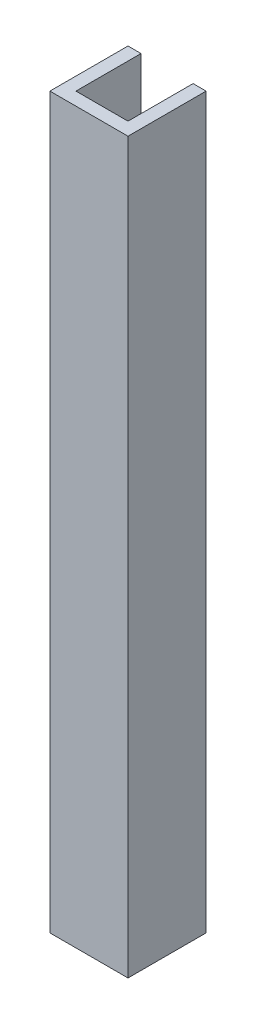
ISO-10303-21;
HEADER;
FILE_DESCRIPTION(('STEP AP214'),'2;1');
FILE_NAME('part.step','',(''),(''),'','','');
FILE_SCHEMA(('AUTOMOTIVE_DESIGN { 1 0 10303 214 1 1 1 1 }'));
ENDSEC;
DATA;
#1=APPLICATION_CONTEXT('core data for automotive mechanical design processes');
#2=APPLICATION_PROTOCOL_DEFINITION('international standard','automotive_design',2000,#1);
#3=PRODUCT_CONTEXT('',#1,'mechanical');
#4=PRODUCT('Part','Part','',(#3));
#5=PRODUCT_RELATED_PRODUCT_CATEGORY('part','',(#4));
#6=PRODUCT_DEFINITION_FORMATION('','',#4);
#7=PRODUCT_DEFINITION_CONTEXT('part definition',#1,'design');
#8=PRODUCT_DEFINITION('design','',#6,#7);
#9=PRODUCT_DEFINITION_SHAPE('','',#8);
#10=(LENGTH_UNIT() NAMED_UNIT(*) SI_UNIT(.MILLI.,.METRE.));
#11=(NAMED_UNIT(*) PLANE_ANGLE_UNIT() SI_UNIT($,.RADIAN.));
#12=(NAMED_UNIT(*) SI_UNIT($,.STERADIAN.) SOLID_ANGLE_UNIT());
#13=UNCERTAINTY_MEASURE_WITH_UNIT(LENGTH_MEASURE(1.E-05),#10,'distance_accuracy_value','');
#14=(GEOMETRIC_REPRESENTATION_CONTEXT(3) GLOBAL_UNCERTAINTY_ASSIGNED_CONTEXT((#13)) GLOBAL_UNIT_ASSIGNED_CONTEXT((#10,
#11,#12)) REPRESENTATION_CONTEXT('',''));
#15=CARTESIAN_POINT('',(0.,0.,0.));
#16=DIRECTION('',(0.,0.,1.));
#17=DIRECTION('',(1.,0.,0.));
#18=AXIS2_PLACEMENT_3D('',#15,#16,#17);
#19=CARTESIAN_POINT('',(0.,177.8,0.));
#20=DIRECTION('',(1.,0.,0.));
#21=DIRECTION('',(0.,0.,-1.));
#22=AXIS2_PLACEMENT_3D('',#19,#20,#21);
#23=PLANE('',#22);
#24=DIRECTION('',(0.,0.,1.));
#25=VECTOR('',#24,1.);
#26=CARTESIAN_POINT('',(0.,0.,0.));
#27=LINE('',#26,#25);
#28=CARTESIAN_POINT('',(0.,0.,-19.05));
#29=VERTEX_POINT('',#28);
#30=CARTESIAN_POINT('',(0.,0.,0.));
#31=VERTEX_POINT('',#30);
#32=EDGE_CURVE('E129',#29,#31,#27,.T.);
#33=ORIENTED_EDGE('',*,*,#32,.T.);
#34=DIRECTION('',(0.,-1.,0.));
#35=VECTOR('',#34,1.);
#36=CARTESIAN_POINT('',(0.,177.8,0.));
#37=LINE('',#36,#35);
#38=CARTESIAN_POINT('',(0.,177.8,0.));
#39=VERTEX_POINT('',#38);
#40=EDGE_CURVE('E11',#39,#31,#37,.T.);
#41=ORIENTED_EDGE('',*,*,#40,.F.);
#42=DIRECTION('',(0.,0.,1.));
#43=VECTOR('',#42,1.);
#44=CARTESIAN_POINT('',(0.,177.8,0.));
#45=LINE('',#44,#43);
#46=CARTESIAN_POINT('',(0.,177.8,-19.05));
#47=VERTEX_POINT('',#46);
#48=EDGE_CURVE('E143',#47,#39,#45,.T.);
#49=ORIENTED_EDGE('',*,*,#48,.F.);
#50=DIRECTION('',(0.,-1.,0.));
#51=VECTOR('',#50,1.);
#52=CARTESIAN_POINT('',(0.,177.8,-19.05));
#53=LINE('',#52,#51);
#54=EDGE_CURVE('E125',#47,#29,#53,.T.);
#55=ORIENTED_EDGE('',*,*,#54,.T.);
#56=EDGE_LOOP('',(#33,#41,#49,#55));
#57=FACE_BOUND('',#56,.T.);
#58=ADVANCED_FACE('F33',(#57),#23,.F.);
#59=CARTESIAN_POINT('',(0.,177.8,0.));
#60=DIRECTION('',(0.,0.,-1.));
#61=DIRECTION('',(-1.,0.,0.));
#62=AXIS2_PLACEMENT_3D('',#59,#60,#61);
#63=PLANE('',#62);
#64=DIRECTION('',(1.,0.,0.));
#65=VECTOR('',#64,1.);
#66=CARTESIAN_POINT('',(0.,0.,0.));
#67=LINE('',#66,#65);
#68=CARTESIAN_POINT('',(19.05,0.,0.));
#69=VERTEX_POINT('',#68);
#70=EDGE_CURVE('E132',#31,#69,#67,.T.);
#71=ORIENTED_EDGE('',*,*,#70,.T.);
#72=DIRECTION('',(0.,-1.,0.));
#73=VECTOR('',#72,1.);
#74=CARTESIAN_POINT('',(19.05,177.8,0.));
#75=LINE('',#74,#73);
#76=CARTESIAN_POINT('',(19.05,177.8,0.));
#77=VERTEX_POINT('',#76);
#78=EDGE_CURVE('E41',#77,#69,#75,.T.);
#79=ORIENTED_EDGE('',*,*,#78,.F.);
#80=DIRECTION('',(1.,0.,0.));
#81=VECTOR('',#80,1.);
#82=CARTESIAN_POINT('',(0.,177.8,0.));
#83=LINE('',#82,#81);
#84=EDGE_CURVE('E92',#39,#77,#83,.T.);
#85=ORIENTED_EDGE('',*,*,#84,.F.);
#86=ORIENTED_EDGE('',*,*,#40,.T.);
#87=EDGE_LOOP('',(#71,#79,#85,#86));
#88=FACE_BOUND('',#87,.T.);
#89=ADVANCED_FACE('F178',(#88),#63,.F.);
#90=CARTESIAN_POINT('',(19.05,177.8,-19.05));
#91=DIRECTION('',(-1.,0.,0.));
#92=DIRECTION('',(0.,0.,1.));
#93=AXIS2_PLACEMENT_3D('',#90,#91,#92);
#94=PLANE('',#93);
#95=DIRECTION('',(0.,0.,-1.));
#96=VECTOR('',#95,1.);
#97=CARTESIAN_POINT('',(19.05,0.,-19.05));
#98=LINE('',#97,#96);
#99=CARTESIAN_POINT('',(19.05,0.,-19.05));
#100=VERTEX_POINT('',#99);
#101=EDGE_CURVE('E134',#69,#100,#98,.T.);
#102=ORIENTED_EDGE('',*,*,#101,.T.);
#103=DIRECTION('',(0.,-1.,0.));
#104=VECTOR('',#103,1.);
#105=CARTESIAN_POINT('',(19.05,177.8,-19.05));
#106=LINE('',#105,#104);
#107=CARTESIAN_POINT('',(19.05,177.8,-19.05));
#108=VERTEX_POINT('',#107);
#109=EDGE_CURVE('E150',#108,#100,#106,.T.);
#110=ORIENTED_EDGE('',*,*,#109,.F.);
#111=DIRECTION('',(0.,0.,-1.));
#112=VECTOR('',#111,1.);
#113=CARTESIAN_POINT('',(19.05,177.8,-19.05));
#114=LINE('',#113,#112);
#115=EDGE_CURVE('E158',#77,#108,#114,.T.);
#116=ORIENTED_EDGE('',*,*,#115,.F.);
#117=ORIENTED_EDGE('',*,*,#78,.T.);
#118=EDGE_LOOP('',(#102,#110,#116,#117));
#119=FACE_BOUND('',#118,.T.);
#120=ADVANCED_FACE('F156',(#119),#94,.F.);
#121=CARTESIAN_POINT('',(15.875,177.8,-19.05));
#122=DIRECTION('',(0.,0.,1.));
#123=DIRECTION('',(1.,0.,0.));
#124=AXIS2_PLACEMENT_3D('',#121,#122,#123);
#125=PLANE('',#124);
#126=DIRECTION('',(-1.,0.,0.));
#127=VECTOR('',#126,1.);
#128=CARTESIAN_POINT('',(15.875,0.,-19.05));
#129=LINE('',#128,#127);
#130=CARTESIAN_POINT('',(15.875,0.,-19.05));
#131=VERTEX_POINT('',#130);
#132=EDGE_CURVE('E136',#100,#131,#129,.T.);
#133=ORIENTED_EDGE('',*,*,#132,.T.);
#134=DIRECTION('',(0.,-1.,0.));
#135=VECTOR('',#134,1.);
#136=CARTESIAN_POINT('',(15.875,177.8,-19.05));
#137=LINE('',#136,#135);
#138=CARTESIAN_POINT('',(15.875,177.8,-19.05));
#139=VERTEX_POINT('',#138);
#140=EDGE_CURVE('E147',#139,#131,#137,.T.);
#141=ORIENTED_EDGE('',*,*,#140,.F.);
#142=DIRECTION('',(-1.,0.,0.));
#143=VECTOR('',#142,1.);
#144=CARTESIAN_POINT('',(15.875,177.8,-19.05));
#145=LINE('',#144,#143);
#146=EDGE_CURVE('E170',#108,#139,#145,.T.);
#147=ORIENTED_EDGE('',*,*,#146,.F.);
#148=ORIENTED_EDGE('',*,*,#109,.T.);
#149=EDGE_LOOP('',(#133,#141,#147,#148));
#150=FACE_BOUND('',#149,.T.);
#151=ADVANCED_FACE('F166',(#150),#125,.F.);
#152=CARTESIAN_POINT('',(15.875,177.8,-3.175));
#153=DIRECTION('',(1.,0.,0.));
#154=DIRECTION('',(0.,0.,-1.));
#155=AXIS2_PLACEMENT_3D('',#152,#153,#154);
#156=PLANE('',#155);
#157=DIRECTION('',(0.,0.,1.));
#158=VECTOR('',#157,1.);
#159=CARTESIAN_POINT('',(15.875,0.,-3.175));
#160=LINE('',#159,#158);
#161=CARTESIAN_POINT('',(15.875,0.,-3.175));
#162=VERTEX_POINT('',#161);
#163=EDGE_CURVE('E138',#131,#162,#160,.T.);
#164=ORIENTED_EDGE('',*,*,#163,.T.);
#165=DIRECTION('',(0.,-1.,0.));
#166=VECTOR('',#165,1.);
#167=CARTESIAN_POINT('',(15.875,177.8,-3.175));
#168=LINE('',#167,#166);
#169=CARTESIAN_POINT('',(15.875,177.8,-3.175));
#170=VERTEX_POINT('',#169);
#171=EDGE_CURVE('E120',#170,#162,#168,.T.);
#172=ORIENTED_EDGE('',*,*,#171,.F.);
#173=DIRECTION('',(0.,0.,1.));
#174=VECTOR('',#173,1.);
#175=CARTESIAN_POINT('',(15.875,177.8,-3.175));
#176=LINE('',#175,#174);
#177=EDGE_CURVE('E111',#139,#170,#176,.T.);
#178=ORIENTED_EDGE('',*,*,#177,.F.);
#179=ORIENTED_EDGE('',*,*,#140,.T.);
#180=EDGE_LOOP('',(#164,#172,#178,#179));
#181=FACE_BOUND('',#180,.T.);
#182=ADVANCED_FACE('F169',(#181),#156,.F.);
#183=CARTESIAN_POINT('',(3.175,177.8,-3.175));
#184=DIRECTION('',(0.,0.,1.));
#185=DIRECTION('',(1.,0.,0.));
#186=AXIS2_PLACEMENT_3D('',#183,#184,#185);
#187=PLANE('',#186);
#188=DIRECTION('',(-1.,0.,0.));
#189=VECTOR('',#188,1.);
#190=CARTESIAN_POINT('',(3.175,0.,-3.175));
#191=LINE('',#190,#189);
#192=CARTESIAN_POINT('',(3.175,0.,-3.175));
#193=VERTEX_POINT('',#192);
#194=EDGE_CURVE('E119',#162,#193,#191,.T.);
#195=ORIENTED_EDGE('',*,*,#194,.T.);
#196=DIRECTION('',(0.,-1.,0.));
#197=VECTOR('',#196,1.);
#198=CARTESIAN_POINT('',(3.175,177.8,-3.175));
#199=LINE('',#198,#197);
#200=CARTESIAN_POINT('',(3.175,177.8,-3.175));
#201=VERTEX_POINT('',#200);
#202=EDGE_CURVE('E116',#201,#193,#199,.T.);
#203=ORIENTED_EDGE('',*,*,#202,.F.);
#204=DIRECTION('',(-1.,0.,0.));
#205=VECTOR('',#204,1.);
#206=CARTESIAN_POINT('',(3.175,177.8,-3.175));
#207=LINE('',#206,#205);
#208=EDGE_CURVE('E105',#170,#201,#207,.T.);
#209=ORIENTED_EDGE('',*,*,#208,.F.);
#210=ORIENTED_EDGE('',*,*,#171,.T.);
#211=EDGE_LOOP('',(#195,#203,#209,#210));
#212=FACE_BOUND('',#211,.T.);
#213=ADVANCED_FACE('F117',(#212),#187,.F.);
#214=CARTESIAN_POINT('',(3.175,177.8,-19.05));
#215=DIRECTION('',(-1.,0.,0.));
#216=DIRECTION('',(0.,0.,1.));
#217=AXIS2_PLACEMENT_3D('',#214,#215,#216);
#218=PLANE('',#217);
#219=DIRECTION('',(0.,0.,-1.));
#220=VECTOR('',#219,1.);
#221=CARTESIAN_POINT('',(3.175,0.,-19.05));
#222=LINE('',#221,#220);
#223=CARTESIAN_POINT('',(3.175,0.,-19.05));
#224=VERTEX_POINT('',#223);
#225=EDGE_CURVE('E78',#193,#224,#222,.T.);
#226=ORIENTED_EDGE('',*,*,#225,.T.);
#227=DIRECTION('',(0.,-1.,0.));
#228=VECTOR('',#227,1.);
#229=CARTESIAN_POINT('',(3.175,177.8,-19.05));
#230=LINE('',#229,#228);
#231=CARTESIAN_POINT('',(3.175,177.8,-19.05));
#232=VERTEX_POINT('',#231);
#233=EDGE_CURVE('E121',#232,#224,#230,.T.);
#234=ORIENTED_EDGE('',*,*,#233,.F.);
#235=DIRECTION('',(0.,0.,-1.));
#236=VECTOR('',#235,1.);
#237=CARTESIAN_POINT('',(3.175,177.8,-19.05));
#238=LINE('',#237,#236);
#239=EDGE_CURVE('E109',#201,#232,#238,.T.);
#240=ORIENTED_EDGE('',*,*,#239,.F.);
#241=ORIENTED_EDGE('',*,*,#202,.T.);
#242=EDGE_LOOP('',(#226,#234,#240,#241));
#243=FACE_BOUND('',#242,.T.);
#244=ADVANCED_FACE('F123',(#243),#218,.F.);
#245=CARTESIAN_POINT('',(0.,177.8,-19.05));
#246=DIRECTION('',(0.,0.,1.));
#247=DIRECTION('',(1.,0.,0.));
#248=AXIS2_PLACEMENT_3D('',#245,#246,#247);
#249=PLANE('',#248);
#250=DIRECTION('',(-1.,0.,0.));
#251=VECTOR('',#250,1.);
#252=CARTESIAN_POINT('',(0.,0.,-19.05));
#253=LINE('',#252,#251);
#254=EDGE_CURVE('E84',#224,#29,#253,.T.);
#255=ORIENTED_EDGE('',*,*,#254,.T.);
#256=ORIENTED_EDGE('',*,*,#54,.F.);
#257=DIRECTION('',(-1.,0.,0.));
#258=VECTOR('',#257,1.);
#259=CARTESIAN_POINT('',(0.,177.8,-19.05));
#260=LINE('',#259,#258);
#261=EDGE_CURVE('E49',#232,#47,#260,.T.);
#262=ORIENTED_EDGE('',*,*,#261,.F.);
#263=ORIENTED_EDGE('',*,*,#233,.T.);
#264=EDGE_LOOP('',(#255,#256,#262,#263));
#265=FACE_BOUND('',#264,.T.);
#266=ADVANCED_FACE('F194',(#265),#249,.F.);
#267=CARTESIAN_POINT('',(0.,177.8,0.));
#268=DIRECTION('',(0.,-1.,0.));
#269=DIRECTION('',(0.,0.,-1.));
#270=AXIS2_PLACEMENT_3D('',#267,#268,#269);
#271=PLANE('',#270);
#272=ORIENTED_EDGE('',*,*,#48,.T.);
#273=ORIENTED_EDGE('',*,*,#84,.T.);
#274=ORIENTED_EDGE('',*,*,#115,.T.);
#275=ORIENTED_EDGE('',*,*,#146,.T.);
#276=ORIENTED_EDGE('',*,*,#177,.T.);
#277=ORIENTED_EDGE('',*,*,#208,.T.);
#278=ORIENTED_EDGE('',*,*,#239,.T.);
#279=ORIENTED_EDGE('',*,*,#261,.T.);
#280=EDGE_LOOP('',(#272,#273,#274,#275,#276,#277,#278,#279));
#281=FACE_BOUND('',#280,.T.);
#282=ADVANCED_FACE('F107',(#281),#271,.F.);
#283=CARTESIAN_POINT('',(0.,0.,0.));
#284=DIRECTION('',(0.,-1.,0.));
#285=DIRECTION('',(0.,0.,-1.));
#286=AXIS2_PLACEMENT_3D('',#283,#284,#285);
#287=PLANE('',#286);
#288=ORIENTED_EDGE('',*,*,#32,.F.);
#289=ORIENTED_EDGE('',*,*,#254,.F.);
#290=ORIENTED_EDGE('',*,*,#225,.F.);
#291=ORIENTED_EDGE('',*,*,#194,.F.);
#292=ORIENTED_EDGE('',*,*,#163,.F.);
#293=ORIENTED_EDGE('',*,*,#132,.F.);
#294=ORIENTED_EDGE('',*,*,#101,.F.);
#295=ORIENTED_EDGE('',*,*,#70,.F.);
#296=EDGE_LOOP('',(#288,#289,#290,#291,#292,#293,#294,#295));
#297=FACE_BOUND('',#296,.T.);
#298=ADVANCED_FACE('F162',(#297),#287,.T.);
#299=CLOSED_SHELL('',(#58,#89,#120,#151,#182,#213,#244,#266,#282,#298));
#300=MANIFOLD_SOLID_BREP('B2',#299);
#301=ADVANCED_BREP_SHAPE_REPRESENTATION('',(#18,#300),#14);
#302=SHAPE_DEFINITION_REPRESENTATION(#9,#301);
ENDSEC;
END-ISO-10303-21;
